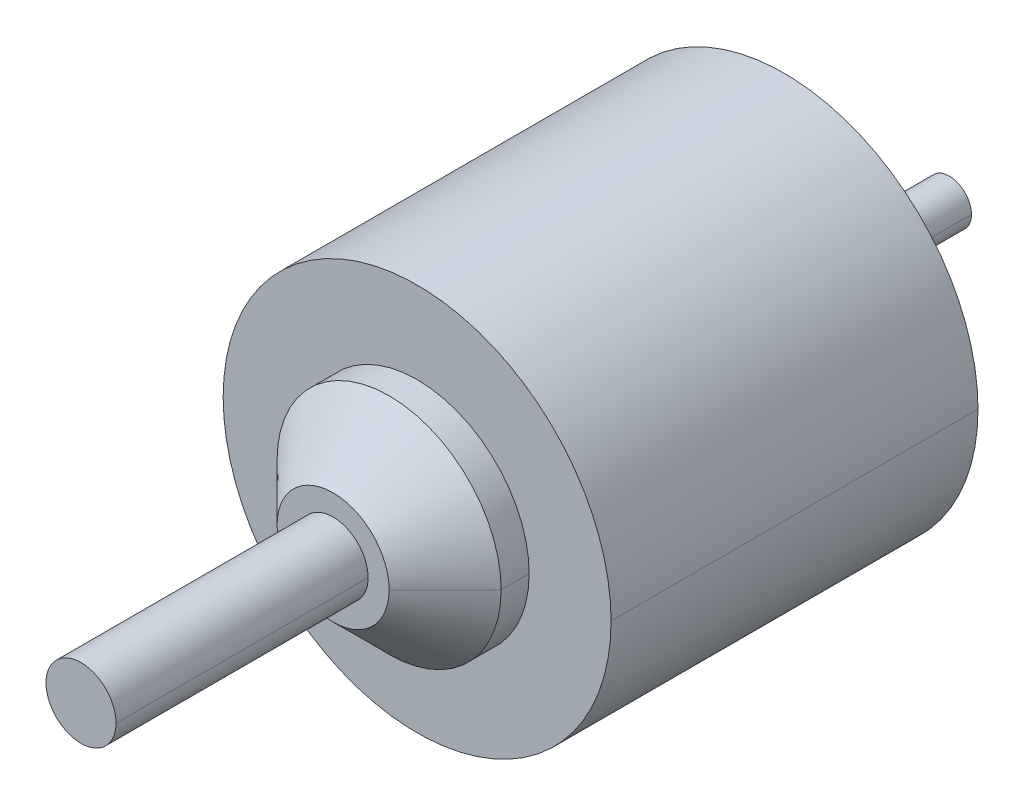
ISO-10303-21;
HEADER;
FILE_DESCRIPTION(('STEP AP214'),'2;1');
FILE_NAME('part.step','',(''),(''),'','','');
FILE_SCHEMA(('AUTOMOTIVE_DESIGN { 1 0 10303 214 1 1 1 1 }'));
ENDSEC;
DATA;
#1=APPLICATION_CONTEXT('core data for automotive mechanical design processes');
#2=APPLICATION_PROTOCOL_DEFINITION('international standard','automotive_design',2000,#1);
#3=PRODUCT_CONTEXT('',#1,'mechanical');
#4=PRODUCT('Part','Part','',(#3));
#5=PRODUCT_RELATED_PRODUCT_CATEGORY('part','',(#4));
#6=PRODUCT_DEFINITION_FORMATION('','',#4);
#7=PRODUCT_DEFINITION_CONTEXT('part definition',#1,'design');
#8=PRODUCT_DEFINITION('design','',#6,#7);
#9=PRODUCT_DEFINITION_SHAPE('','',#8);
#10=(LENGTH_UNIT() NAMED_UNIT(*) SI_UNIT(.MILLI.,.METRE.));
#11=(NAMED_UNIT(*) PLANE_ANGLE_UNIT() SI_UNIT($,.RADIAN.));
#12=(NAMED_UNIT(*) SI_UNIT($,.STERADIAN.) SOLID_ANGLE_UNIT());
#13=UNCERTAINTY_MEASURE_WITH_UNIT(LENGTH_MEASURE(1.E-05),#10,'distance_accuracy_value','');
#14=(GEOMETRIC_REPRESENTATION_CONTEXT(3) GLOBAL_UNCERTAINTY_ASSIGNED_CONTEXT((#13)) GLOBAL_UNIT_ASSIGNED_CONTEXT((#10,
#11,#12)) REPRESENTATION_CONTEXT('',''));
#15=CARTESIAN_POINT('',(0.,0.,0.));
#16=DIRECTION('',(0.,0.,1.));
#17=DIRECTION('',(1.,0.,0.));
#18=AXIS2_PLACEMENT_3D('',#15,#16,#17);
#19=CARTESIAN_POINT('',(0.,0.,50.2));
#20=DIRECTION('',(0.,0.,1.));
#21=DIRECTION('',(1.,0.,0.));
#22=AXIS2_PLACEMENT_3D('',#19,#20,#21);
#23=PLANE('',#22);
#24=CARTESIAN_POINT('',(0.,0.,50.2));
#25=DIRECTION('',(0.,0.,1.));
#26=DIRECTION('',(1.,0.,0.));
#27=AXIS2_PLACEMENT_3D('',#24,#25,#26);
#28=CIRCLE('',#27,2.5);
#29=CARTESIAN_POINT('',(2.5,0.,50.2));
#30=VERTEX_POINT('',#29);
#31=CARTESIAN_POINT('',(-2.5,0.,50.2));
#32=VERTEX_POINT('',#31);
#33=EDGE_CURVE('E11',#30,#32,#28,.T.);
#34=ORIENTED_EDGE('',*,*,#33,.T.);
#35=CARTESIAN_POINT('',(0.,0.,50.2));
#36=DIRECTION('',(0.,0.,1.));
#37=DIRECTION('',(1.,0.,0.));
#38=AXIS2_PLACEMENT_3D('',#35,#36,#37);
#39=CIRCLE('',#38,2.5);
#40=EDGE_CURVE('E335',#32,#30,#39,.T.);
#41=ORIENTED_EDGE('',*,*,#40,.T.);
#42=EDGE_LOOP('',(#34,#41));
#43=FACE_BOUND('',#42,.T.);
#44=ADVANCED_FACE('F18',(#43),#23,.T.);
#45=CARTESIAN_POINT('',(0.,0.,38.2));
#46=DIRECTION('',(0.,0.,1.));
#47=DIRECTION('',(1.,0.,0.));
#48=AXIS2_PLACEMENT_3D('',#45,#46,#47);
#49=CYLINDRICAL_SURFACE('',#48,2.5);
#50=DIRECTION('',(0.,0.,1.));
#51=VECTOR('',#50,1.);
#52=CARTESIAN_POINT('',(-2.5,0.,38.2));
#53=LINE('',#52,#51);
#54=CARTESIAN_POINT('',(-2.5,0.,32.2));
#55=VERTEX_POINT('',#54);
#56=EDGE_CURVE('E29',#55,#32,#53,.T.);
#57=ORIENTED_EDGE('',*,*,#56,.T.);
#58=ORIENTED_EDGE('',*,*,#33,.F.);
#59=DIRECTION('',(0.,0.,1.));
#60=VECTOR('',#59,1.);
#61=CARTESIAN_POINT('',(2.5,0.,38.2));
#62=LINE('',#61,#60);
#63=CARTESIAN_POINT('',(2.5,0.,32.2));
#64=VERTEX_POINT('',#63);
#65=EDGE_CURVE('E167',#64,#30,#62,.T.);
#66=ORIENTED_EDGE('',*,*,#65,.F.);
#67=CARTESIAN_POINT('',(0.,0.,32.2));
#68=DIRECTION('',(0.,0.,1.));
#69=DIRECTION('',(1.,0.,0.));
#70=AXIS2_PLACEMENT_3D('',#67,#68,#69);
#71=CIRCLE('',#70,2.5);
#72=EDGE_CURVE('E276',#64,#55,#71,.T.);
#73=ORIENTED_EDGE('',*,*,#72,.T.);
#74=EDGE_LOOP('',(#57,#58,#66,#73));
#75=FACE_BOUND('',#74,.T.);
#76=ADVANCED_FACE('F390',(#75),#49,.T.);
#77=CARTESIAN_POINT('',(0.,0.,38.2));
#78=DIRECTION('',(0.,0.,1.));
#79=DIRECTION('',(1.,0.,0.));
#80=AXIS2_PLACEMENT_3D('',#77,#78,#79);
#81=CYLINDRICAL_SURFACE('',#80,2.5);
#82=ORIENTED_EDGE('',*,*,#65,.T.);
#83=ORIENTED_EDGE('',*,*,#40,.F.);
#84=ORIENTED_EDGE('',*,*,#56,.F.);
#85=CARTESIAN_POINT('',(0.,0.,32.2));
#86=DIRECTION('',(0.,0.,1.));
#87=DIRECTION('',(1.,0.,0.));
#88=AXIS2_PLACEMENT_3D('',#85,#86,#87);
#89=CIRCLE('',#88,2.5);
#90=EDGE_CURVE('E278',#55,#64,#89,.T.);
#91=ORIENTED_EDGE('',*,*,#90,.T.);
#92=EDGE_LOOP('',(#82,#83,#84,#91));
#93=FACE_BOUND('',#92,.T.);
#94=ADVANCED_FACE('F387',(#93),#81,.T.);
#95=CARTESIAN_POINT('',(0.,0.,-5.9));
#96=DIRECTION('',(0.,0.,-1.));
#97=DIRECTION('',(1.,0.,0.));
#98=AXIS2_PLACEMENT_3D('',#95,#96,#97);
#99=CYLINDRICAL_SURFACE('',#98,1.585);
#100=DIRECTION('',(0.,0.,-1.));
#101=VECTOR('',#100,1.);
#102=CARTESIAN_POINT('',(1.585,0.,-5.9));
#103=LINE('',#102,#101);
#104=CARTESIAN_POINT('',(1.585,0.,0.));
#105=VERTEX_POINT('',#104);
#106=CARTESIAN_POINT('',(1.585,0.,-11.8));
#107=VERTEX_POINT('',#106);
#108=EDGE_CURVE('E245',#105,#107,#103,.T.);
#109=ORIENTED_EDGE('',*,*,#108,.F.);
#110=CARTESIAN_POINT('',(0.,0.,0.));
#111=DIRECTION('',(0.,0.,-1.));
#112=DIRECTION('',(1.,0.,0.));
#113=AXIS2_PLACEMENT_3D('',#110,#111,#112);
#114=CIRCLE('',#113,1.585);
#115=CARTESIAN_POINT('',(-1.585,0.,0.));
#116=VERTEX_POINT('',#115);
#117=EDGE_CURVE('E246',#105,#116,#114,.T.);
#118=ORIENTED_EDGE('',*,*,#117,.T.);
#119=DIRECTION('',(0.,0.,-1.));
#120=VECTOR('',#119,1.);
#121=CARTESIAN_POINT('',(-1.585,0.,-5.9));
#122=LINE('',#121,#120);
#123=CARTESIAN_POINT('',(-1.585,0.,-11.8));
#124=VERTEX_POINT('',#123);
#125=EDGE_CURVE('E242',#116,#124,#122,.T.);
#126=ORIENTED_EDGE('',*,*,#125,.T.);
#127=CARTESIAN_POINT('',(0.,0.,-11.8));
#128=DIRECTION('',(0.,0.,-1.));
#129=DIRECTION('',(1.,0.,0.));
#130=AXIS2_PLACEMENT_3D('',#127,#128,#129);
#131=CIRCLE('',#130,1.585);
#132=EDGE_CURVE('E306',#107,#124,#131,.T.);
#133=ORIENTED_EDGE('',*,*,#132,.F.);
#134=EDGE_LOOP('',(#109,#118,#126,#133));
#135=FACE_BOUND('',#134,.T.);
#136=ADVANCED_FACE('F389',(#135),#99,.T.);
#137=CARTESIAN_POINT('',(0.,0.,-5.9));
#138=DIRECTION('',(0.,0.,-1.));
#139=DIRECTION('',(1.,0.,0.));
#140=AXIS2_PLACEMENT_3D('',#137,#138,#139);
#141=CYLINDRICAL_SURFACE('',#140,1.585);
#142=ORIENTED_EDGE('',*,*,#125,.F.);
#143=CARTESIAN_POINT('',(0.,0.,0.));
#144=DIRECTION('',(0.,0.,-1.));
#145=DIRECTION('',(1.,0.,0.));
#146=AXIS2_PLACEMENT_3D('',#143,#144,#145);
#147=CIRCLE('',#146,1.585);
#148=EDGE_CURVE('E247',#116,#105,#147,.T.);
#149=ORIENTED_EDGE('',*,*,#148,.T.);
#150=ORIENTED_EDGE('',*,*,#108,.T.);
#151=CARTESIAN_POINT('',(0.,0.,-11.8));
#152=DIRECTION('',(0.,0.,-1.));
#153=DIRECTION('',(1.,0.,0.));
#154=AXIS2_PLACEMENT_3D('',#151,#152,#153);
#155=CIRCLE('',#154,1.585);
#156=EDGE_CURVE('E251',#124,#107,#155,.T.);
#157=ORIENTED_EDGE('',*,*,#156,.F.);
#158=EDGE_LOOP('',(#142,#149,#150,#157));
#159=FACE_BOUND('',#158,.T.);
#160=ADVANCED_FACE('F397',(#159),#141,.T.);
#161=CARTESIAN_POINT('',(0.,0.,0.));
#162=DIRECTION('',(0.,0.,1.));
#163=DIRECTION('',(1.,0.,0.));
#164=AXIS2_PLACEMENT_3D('',#161,#162,#163);
#165=PLANE('',#164);
#166=ORIENTED_EDGE('',*,*,#148,.F.);
#167=ORIENTED_EDGE('',*,*,#117,.F.);
#168=EDGE_LOOP('',(#166,#167));
#169=FACE_BOUND('',#168,.T.);
#170=CARTESIAN_POINT('',(9.5,0.,0.));
#171=DIRECTION('',(0.,0.,-1.));
#172=DIRECTION('',(1.,0.,0.));
#173=AXIS2_PLACEMENT_3D('',#170,#171,#172);
#174=CIRCLE('',#173,1.5);
#175=CARTESIAN_POINT('',(8.,0.,0.));
#176=VERTEX_POINT('',#175);
#177=CARTESIAN_POINT('',(11.,0.,0.));
#178=VERTEX_POINT('',#177);
#179=EDGE_CURVE('E261',#176,#178,#174,.T.);
#180=ORIENTED_EDGE('',*,*,#179,.F.);
#181=CARTESIAN_POINT('',(9.5,0.,0.));
#182=DIRECTION('',(0.,0.,-1.));
#183=DIRECTION('',(1.,0.,0.));
#184=AXIS2_PLACEMENT_3D('',#181,#182,#183);
#185=CIRCLE('',#184,1.5);
#186=EDGE_CURVE('E271',#178,#176,#185,.T.);
#187=ORIENTED_EDGE('',*,*,#186,.F.);
#188=EDGE_LOOP('',(#180,#187));
#189=FACE_BOUND('',#188,.T.);
#190=CARTESIAN_POINT('',(0.,-8.,0.));
#191=DIRECTION('',(0.,0.,-1.));
#192=DIRECTION('',(1.,0.,0.));
#193=AXIS2_PLACEMENT_3D('',#190,#191,#192);
#194=CIRCLE('',#193,1.5);
#195=CARTESIAN_POINT('',(-1.5,-8.,0.));
#196=VERTEX_POINT('',#195);
#197=CARTESIAN_POINT('',(1.5,-8.,0.));
#198=VERTEX_POINT('',#197);
#199=EDGE_CURVE('E254',#196,#198,#194,.T.);
#200=ORIENTED_EDGE('',*,*,#199,.F.);
#201=CARTESIAN_POINT('',(0.,-8.,0.));
#202=DIRECTION('',(0.,0.,-1.));
#203=DIRECTION('',(1.,0.,0.));
#204=AXIS2_PLACEMENT_3D('',#201,#202,#203);
#205=CIRCLE('',#204,1.5);
#206=EDGE_CURVE('E303',#198,#196,#205,.T.);
#207=ORIENTED_EDGE('',*,*,#206,.F.);
#208=EDGE_LOOP('',(#200,#207));
#209=FACE_BOUND('',#208,.T.);
#210=CARTESIAN_POINT('',(0.,8.,0.));
#211=DIRECTION('',(0.,0.,-1.));
#212=DIRECTION('',(1.,0.,0.));
#213=AXIS2_PLACEMENT_3D('',#210,#211,#212);
#214=CIRCLE('',#213,1.5);
#215=CARTESIAN_POINT('',(-1.5,8.,0.));
#216=VERTEX_POINT('',#215);
#217=CARTESIAN_POINT('',(1.5,8.,0.));
#218=VERTEX_POINT('',#217);
#219=EDGE_CURVE('E201',#216,#218,#214,.T.);
#220=ORIENTED_EDGE('',*,*,#219,.F.);
#221=CARTESIAN_POINT('',(0.,8.,0.));
#222=DIRECTION('',(0.,0.,-1.));
#223=DIRECTION('',(1.,0.,0.));
#224=AXIS2_PLACEMENT_3D('',#221,#222,#223);
#225=CIRCLE('',#224,1.5);
#226=EDGE_CURVE('E196',#218,#216,#225,.T.);
#227=ORIENTED_EDGE('',*,*,#226,.F.);
#228=EDGE_LOOP('',(#220,#227));
#229=FACE_BOUND('',#228,.T.);
#230=CARTESIAN_POINT('',(-9.5,0.,0.));
#231=DIRECTION('',(0.,0.,-1.));
#232=DIRECTION('',(1.,0.,0.));
#233=AXIS2_PLACEMENT_3D('',#230,#231,#232);
#234=CIRCLE('',#233,1.5);
#235=CARTESIAN_POINT('',(-8.,0.,0.));
#236=VERTEX_POINT('',#235);
#237=CARTESIAN_POINT('',(-11.,0.,0.));
#238=VERTEX_POINT('',#237);
#239=EDGE_CURVE('E234',#236,#238,#234,.T.);
#240=ORIENTED_EDGE('',*,*,#239,.F.);
#241=CARTESIAN_POINT('',(-9.5,0.,0.));
#242=DIRECTION('',(0.,0.,-1.));
#243=DIRECTION('',(1.,0.,0.));
#244=AXIS2_PLACEMENT_3D('',#241,#242,#243);
#245=CIRCLE('',#244,1.5);
#246=EDGE_CURVE('E202',#238,#236,#245,.T.);
#247=ORIENTED_EDGE('',*,*,#246,.F.);
#248=EDGE_LOOP('',(#240,#247));
#249=FACE_BOUND('',#248,.T.);
#250=CARTESIAN_POINT('',(0.,0.,0.));
#251=DIRECTION('',(0.,0.,1.));
#252=DIRECTION('',(1.,0.,0.));
#253=AXIS2_PLACEMENT_3D('',#250,#251,#252);
#254=CIRCLE('',#253,13.85);
#255=CARTESIAN_POINT('',(-13.85,0.,0.));
#256=VERTEX_POINT('',#255);
#257=CARTESIAN_POINT('',(13.85,0.,0.));
#258=VERTEX_POINT('',#257);
#259=EDGE_CURVE('E270',#256,#258,#254,.T.);
#260=ORIENTED_EDGE('',*,*,#259,.F.);
#261=CARTESIAN_POINT('',(0.,0.,0.));
#262=DIRECTION('',(0.,0.,1.));
#263=DIRECTION('',(1.,0.,0.));
#264=AXIS2_PLACEMENT_3D('',#261,#262,#263);
#265=CIRCLE('',#264,13.85);
#266=EDGE_CURVE('E310',#258,#256,#265,.T.);
#267=ORIENTED_EDGE('',*,*,#266,.F.);
#268=EDGE_LOOP('',(#260,#267));
#269=FACE_BOUND('',#268,.T.);
#270=ADVANCED_FACE('F425',(#169,#189,#209,#229,#249,#269),#165,.F.);
#271=CARTESIAN_POINT('',(0.,0.,-11.8));
#272=DIRECTION('',(0.,0.,-1.));
#273=DIRECTION('',(0.,-1.,0.));
#274=AXIS2_PLACEMENT_3D('',#271,#272,#273);
#275=PLANE('',#274);
#276=ORIENTED_EDGE('',*,*,#132,.T.);
#277=ORIENTED_EDGE('',*,*,#156,.T.);
#278=EDGE_LOOP('',(#276,#277));
#279=FACE_BOUND('',#278,.T.);
#280=ADVANCED_FACE('F422',(#279),#275,.T.);
#281=CARTESIAN_POINT('',(0.,0.,13.1));
#282=DIRECTION('',(0.,0.,1.));
#283=DIRECTION('',(1.,0.,0.));
#284=AXIS2_PLACEMENT_3D('',#281,#282,#283);
#285=CYLINDRICAL_SURFACE('',#284,13.85);
#286=DIRECTION('',(0.,0.,1.));
#287=VECTOR('',#286,1.);
#288=CARTESIAN_POINT('',(13.85,0.,13.1));
#289=LINE('',#288,#287);
#290=CARTESIAN_POINT('',(13.85,0.,26.2));
#291=VERTEX_POINT('',#290);
#292=EDGE_CURVE('E317',#258,#291,#289,.T.);
#293=ORIENTED_EDGE('',*,*,#292,.F.);
#294=ORIENTED_EDGE('',*,*,#266,.T.);
#295=DIRECTION('',(0.,0.,1.));
#296=VECTOR('',#295,1.);
#297=CARTESIAN_POINT('',(-13.85,0.,13.1));
#298=LINE('',#297,#296);
#299=CARTESIAN_POINT('',(-13.85,0.,26.2));
#300=VERTEX_POINT('',#299);
#301=EDGE_CURVE('E267',#256,#300,#298,.T.);
#302=ORIENTED_EDGE('',*,*,#301,.T.);
#303=CARTESIAN_POINT('',(0.,0.,26.2));
#304=DIRECTION('',(0.,0.,1.));
#305=DIRECTION('',(1.,0.,0.));
#306=AXIS2_PLACEMENT_3D('',#303,#304,#305);
#307=CIRCLE('',#306,13.85);
#308=EDGE_CURVE('E259',#291,#300,#307,.T.);
#309=ORIENTED_EDGE('',*,*,#308,.F.);
#310=EDGE_LOOP('',(#293,#294,#302,#309));
#311=FACE_BOUND('',#310,.T.);
#312=ADVANCED_FACE('F20',(#311),#285,.T.);
#313=CARTESIAN_POINT('',(0.,0.,13.1));
#314=DIRECTION('',(0.,0.,1.));
#315=DIRECTION('',(1.,0.,0.));
#316=AXIS2_PLACEMENT_3D('',#313,#314,#315);
#317=CYLINDRICAL_SURFACE('',#316,13.85);
#318=ORIENTED_EDGE('',*,*,#301,.F.);
#319=ORIENTED_EDGE('',*,*,#259,.T.);
#320=ORIENTED_EDGE('',*,*,#292,.T.);
#321=CARTESIAN_POINT('',(0.,0.,26.2));
#322=DIRECTION('',(0.,0.,1.));
#323=DIRECTION('',(1.,0.,0.));
#324=AXIS2_PLACEMENT_3D('',#321,#322,#323);
#325=CIRCLE('',#324,13.85);
#326=EDGE_CURVE('E235',#300,#291,#325,.T.);
#327=ORIENTED_EDGE('',*,*,#326,.F.);
#328=EDGE_LOOP('',(#318,#319,#320,#327));
#329=FACE_BOUND('',#328,.T.);
#330=ADVANCED_FACE('F350',(#329),#317,.T.);
#331=CARTESIAN_POINT('',(9.5,0.,2.));
#332=DIRECTION('',(0.,0.,-1.));
#333=DIRECTION('',(1.,0.,0.));
#334=AXIS2_PLACEMENT_3D('',#331,#332,#333);
#335=CYLINDRICAL_SURFACE('',#334,1.5);
#336=DIRECTION('',(0.,0.,1.));
#337=VECTOR('',#336,1.);
#338=CARTESIAN_POINT('',(11.,0.,2.));
#339=LINE('',#338,#337);
#340=CARTESIAN_POINT('',(11.,0.,4.));
#341=VERTEX_POINT('',#340);
#342=EDGE_CURVE('E265',#178,#341,#339,.T.);
#343=ORIENTED_EDGE('',*,*,#342,.F.);
#344=ORIENTED_EDGE('',*,*,#186,.T.);
#345=DIRECTION('',(0.,0.,1.));
#346=VECTOR('',#345,1.);
#347=CARTESIAN_POINT('',(8.,0.,2.));
#348=LINE('',#347,#346);
#349=CARTESIAN_POINT('',(8.,0.,4.));
#350=VERTEX_POINT('',#349);
#351=EDGE_CURVE('E266',#176,#350,#348,.T.);
#352=ORIENTED_EDGE('',*,*,#351,.T.);
#353=CARTESIAN_POINT('',(9.5,0.,4.));
#354=DIRECTION('',(0.,0.,-1.));
#355=DIRECTION('',(1.,0.,0.));
#356=AXIS2_PLACEMENT_3D('',#353,#354,#355);
#357=CIRCLE('',#356,1.5);
#358=EDGE_CURVE('E260',#341,#350,#357,.T.);
#359=ORIENTED_EDGE('',*,*,#358,.F.);
#360=EDGE_LOOP('',(#343,#344,#352,#359));
#361=FACE_BOUND('',#360,.T.);
#362=ADVANCED_FACE('F418',(#361),#335,.F.);
#363=CARTESIAN_POINT('',(9.5,0.,2.));
#364=DIRECTION('',(0.,0.,-1.));
#365=DIRECTION('',(1.,0.,0.));
#366=AXIS2_PLACEMENT_3D('',#363,#364,#365);
#367=CYLINDRICAL_SURFACE('',#366,1.5);
#368=ORIENTED_EDGE('',*,*,#351,.F.);
#369=ORIENTED_EDGE('',*,*,#179,.T.);
#370=ORIENTED_EDGE('',*,*,#342,.T.);
#371=CARTESIAN_POINT('',(9.5,0.,4.));
#372=DIRECTION('',(0.,0.,-1.));
#373=DIRECTION('',(1.,0.,0.));
#374=AXIS2_PLACEMENT_3D('',#371,#372,#373);
#375=CIRCLE('',#374,1.5);
#376=EDGE_CURVE('E255',#350,#341,#375,.T.);
#377=ORIENTED_EDGE('',*,*,#376,.F.);
#378=EDGE_LOOP('',(#368,#369,#370,#377));
#379=FACE_BOUND('',#378,.T.);
#380=ADVANCED_FACE('F416',(#379),#367,.F.);
#381=CARTESIAN_POINT('',(0.,-8.,2.));
#382=DIRECTION('',(0.,0.,-1.));
#383=DIRECTION('',(1.,0.,0.));
#384=AXIS2_PLACEMENT_3D('',#381,#382,#383);
#385=CYLINDRICAL_SURFACE('',#384,1.5);
#386=DIRECTION('',(0.,0.,1.));
#387=VECTOR('',#386,1.);
#388=CARTESIAN_POINT('',(1.5,-8.,2.));
#389=LINE('',#388,#387);
#390=CARTESIAN_POINT('',(1.5,-8.,4.));
#391=VERTEX_POINT('',#390);
#392=EDGE_CURVE('E301',#198,#391,#389,.T.);
#393=ORIENTED_EDGE('',*,*,#392,.F.);
#394=ORIENTED_EDGE('',*,*,#206,.T.);
#395=DIRECTION('',(0.,0.,1.));
#396=VECTOR('',#395,1.);
#397=CARTESIAN_POINT('',(-1.5,-8.,2.));
#398=LINE('',#397,#396);
#399=CARTESIAN_POINT('',(-1.5,-8.,4.));
#400=VERTEX_POINT('',#399);
#401=EDGE_CURVE('E240',#196,#400,#398,.T.);
#402=ORIENTED_EDGE('',*,*,#401,.T.);
#403=CARTESIAN_POINT('',(0.,-8.,4.));
#404=DIRECTION('',(0.,0.,-1.));
#405=DIRECTION('',(1.,0.,0.));
#406=AXIS2_PLACEMENT_3D('',#403,#404,#405);
#407=CIRCLE('',#406,1.5);
#408=EDGE_CURVE('E210',#391,#400,#407,.T.);
#409=ORIENTED_EDGE('',*,*,#408,.F.);
#410=EDGE_LOOP('',(#393,#394,#402,#409));
#411=FACE_BOUND('',#410,.T.);
#412=ADVANCED_FACE('F412',(#411),#385,.F.);
#413=CARTESIAN_POINT('',(0.,-8.,2.));
#414=DIRECTION('',(0.,0.,-1.));
#415=DIRECTION('',(1.,0.,0.));
#416=AXIS2_PLACEMENT_3D('',#413,#414,#415);
#417=CYLINDRICAL_SURFACE('',#416,1.5);
#418=ORIENTED_EDGE('',*,*,#401,.F.);
#419=ORIENTED_EDGE('',*,*,#199,.T.);
#420=ORIENTED_EDGE('',*,*,#392,.T.);
#421=CARTESIAN_POINT('',(0.,-8.,4.));
#422=DIRECTION('',(0.,0.,-1.));
#423=DIRECTION('',(1.,0.,0.));
#424=AXIS2_PLACEMENT_3D('',#421,#422,#423);
#425=CIRCLE('',#424,1.5);
#426=EDGE_CURVE('E314',#400,#391,#425,.T.);
#427=ORIENTED_EDGE('',*,*,#426,.F.);
#428=EDGE_LOOP('',(#418,#419,#420,#427));
#429=FACE_BOUND('',#428,.T.);
#430=ADVANCED_FACE('F415',(#429),#417,.F.);
#431=CARTESIAN_POINT('',(0.,8.,2.));
#432=DIRECTION('',(0.,0.,-1.));
#433=DIRECTION('',(1.,0.,0.));
#434=AXIS2_PLACEMENT_3D('',#431,#432,#433);
#435=CYLINDRICAL_SURFACE('',#434,1.5);
#436=DIRECTION('',(0.,0.,1.));
#437=VECTOR('',#436,1.);
#438=CARTESIAN_POINT('',(1.5,8.,2.));
#439=LINE('',#438,#437);
#440=CARTESIAN_POINT('',(1.5,8.,4.));
#441=VERTEX_POINT('',#440);
#442=EDGE_CURVE('E207',#218,#441,#439,.T.);
#443=ORIENTED_EDGE('',*,*,#442,.F.);
#444=ORIENTED_EDGE('',*,*,#226,.T.);
#445=DIRECTION('',(0.,0.,1.));
#446=VECTOR('',#445,1.);
#447=CARTESIAN_POINT('',(-1.5,8.,2.));
#448=LINE('',#447,#446);
#449=CARTESIAN_POINT('',(-1.5,8.,4.));
#450=VERTEX_POINT('',#449);
#451=EDGE_CURVE('E190',#216,#450,#448,.T.);
#452=ORIENTED_EDGE('',*,*,#451,.T.);
#453=CARTESIAN_POINT('',(0.,8.,4.));
#454=DIRECTION('',(0.,0.,-1.));
#455=DIRECTION('',(1.,0.,0.));
#456=AXIS2_PLACEMENT_3D('',#453,#454,#455);
#457=CIRCLE('',#456,1.5);
#458=EDGE_CURVE('E195',#441,#450,#457,.T.);
#459=ORIENTED_EDGE('',*,*,#458,.F.);
#460=EDGE_LOOP('',(#443,#444,#452,#459));
#461=FACE_BOUND('',#460,.T.);
#462=ADVANCED_FACE('F193',(#461),#435,.F.);
#463=CARTESIAN_POINT('',(0.,8.,2.));
#464=DIRECTION('',(0.,0.,-1.));
#465=DIRECTION('',(1.,0.,0.));
#466=AXIS2_PLACEMENT_3D('',#463,#464,#465);
#467=CYLINDRICAL_SURFACE('',#466,1.5);
#468=ORIENTED_EDGE('',*,*,#451,.F.);
#469=ORIENTED_EDGE('',*,*,#219,.T.);
#470=ORIENTED_EDGE('',*,*,#442,.T.);
#471=CARTESIAN_POINT('',(0.,8.,4.));
#472=DIRECTION('',(0.,0.,-1.));
#473=DIRECTION('',(1.,0.,0.));
#474=AXIS2_PLACEMENT_3D('',#471,#472,#473);
#475=CIRCLE('',#474,1.5);
#476=EDGE_CURVE('E205',#450,#441,#475,.T.);
#477=ORIENTED_EDGE('',*,*,#476,.F.);
#478=EDGE_LOOP('',(#468,#469,#470,#477));
#479=FACE_BOUND('',#478,.T.);
#480=ADVANCED_FACE('F206',(#479),#467,.F.);
#481=CARTESIAN_POINT('',(-9.5,0.,2.));
#482=DIRECTION('',(0.,0.,-1.));
#483=DIRECTION('',(-1.,0.,0.));
#484=AXIS2_PLACEMENT_3D('',#481,#482,#483);
#485=CYLINDRICAL_SURFACE('',#484,1.5);
#486=DIRECTION('',(0.,0.,1.));
#487=VECTOR('',#486,1.);
#488=CARTESIAN_POINT('',(-11.,0.,2.));
#489=LINE('',#488,#487);
#490=CARTESIAN_POINT('',(-11.,0.,4.));
#491=VERTEX_POINT('',#490);
#492=EDGE_CURVE('E236',#238,#491,#489,.T.);
#493=ORIENTED_EDGE('',*,*,#492,.F.);
#494=ORIENTED_EDGE('',*,*,#246,.T.);
#495=DIRECTION('',(0.,0.,1.));
#496=VECTOR('',#495,1.);
#497=CARTESIAN_POINT('',(-8.,0.,2.));
#498=LINE('',#497,#496);
#499=CARTESIAN_POINT('',(-8.,0.,4.));
#500=VERTEX_POINT('',#499);
#501=EDGE_CURVE('E231',#236,#500,#498,.T.);
#502=ORIENTED_EDGE('',*,*,#501,.T.);
#503=CARTESIAN_POINT('',(-9.5,0.,4.));
#504=DIRECTION('',(0.,0.,-1.));
#505=DIRECTION('',(1.,0.,0.));
#506=AXIS2_PLACEMENT_3D('',#503,#504,#505);
#507=CIRCLE('',#506,1.5);
#508=EDGE_CURVE('E220',#491,#500,#507,.T.);
#509=ORIENTED_EDGE('',*,*,#508,.F.);
#510=EDGE_LOOP('',(#493,#494,#502,#509));
#511=FACE_BOUND('',#510,.T.);
#512=ADVANCED_FACE('F411',(#511),#485,.F.);
#513=CARTESIAN_POINT('',(-9.5,0.,2.));
#514=DIRECTION('',(0.,0.,-1.));
#515=DIRECTION('',(-1.,0.,0.));
#516=AXIS2_PLACEMENT_3D('',#513,#514,#515);
#517=CYLINDRICAL_SURFACE('',#516,1.5);
#518=ORIENTED_EDGE('',*,*,#501,.F.);
#519=ORIENTED_EDGE('',*,*,#239,.T.);
#520=ORIENTED_EDGE('',*,*,#492,.T.);
#521=CARTESIAN_POINT('',(-9.5,0.,4.));
#522=DIRECTION('',(0.,0.,-1.));
#523=DIRECTION('',(1.,0.,0.));
#524=AXIS2_PLACEMENT_3D('',#521,#522,#523);
#525=CIRCLE('',#524,1.5);
#526=EDGE_CURVE('E22',#500,#491,#525,.T.);
#527=ORIENTED_EDGE('',*,*,#526,.F.);
#528=EDGE_LOOP('',(#518,#519,#520,#527));
#529=FACE_BOUND('',#528,.T.);
#530=ADVANCED_FACE('F429',(#529),#517,.F.);
#531=CARTESIAN_POINT('',(0.,0.,26.2));
#532=DIRECTION('',(0.,0.,1.));
#533=DIRECTION('',(1.,0.,0.));
#534=AXIS2_PLACEMENT_3D('',#531,#532,#533);
#535=PLANE('',#534);
#536=CARTESIAN_POINT('',(0.,0.,26.2));
#537=DIRECTION('',(0.,0.,1.));
#538=DIRECTION('',(1.,0.,0.));
#539=AXIS2_PLACEMENT_3D('',#536,#537,#538);
#540=CIRCLE('',#539,8.);
#541=CARTESIAN_POINT('',(8.,0.,26.2));
#542=VERTEX_POINT('',#541);
#543=CARTESIAN_POINT('',(-8.,0.,26.2));
#544=VERTEX_POINT('',#543);
#545=EDGE_CURVE('E149',#542,#544,#540,.T.);
#546=ORIENTED_EDGE('',*,*,#545,.F.);
#547=CARTESIAN_POINT('',(0.,0.,26.2));
#548=DIRECTION('',(0.,0.,1.));
#549=DIRECTION('',(1.,0.,0.));
#550=AXIS2_PLACEMENT_3D('',#547,#548,#549);
#551=CIRCLE('',#550,8.);
#552=EDGE_CURVE('E225',#544,#542,#551,.T.);
#553=ORIENTED_EDGE('',*,*,#552,.F.);
#554=EDGE_LOOP('',(#546,#553));
#555=FACE_BOUND('',#554,.T.);
#556=ORIENTED_EDGE('',*,*,#308,.T.);
#557=ORIENTED_EDGE('',*,*,#326,.T.);
#558=EDGE_LOOP('',(#556,#557));
#559=FACE_BOUND('',#558,.T.);
#560=ADVANCED_FACE('F342',(#555,#559),#535,.T.);
#561=CARTESIAN_POINT('',(0.,0.,4.));
#562=DIRECTION('',(0.,0.,-1.));
#563=DIRECTION('',(0.,-1.,0.));
#564=AXIS2_PLACEMENT_3D('',#561,#562,#563);
#565=PLANE('',#564);
#566=ORIENTED_EDGE('',*,*,#358,.T.);
#567=ORIENTED_EDGE('',*,*,#376,.T.);
#568=EDGE_LOOP('',(#566,#567));
#569=FACE_BOUND('',#568,.T.);
#570=ADVANCED_FACE('F443',(#569),#565,.T.);
#571=CARTESIAN_POINT('',(0.,0.,4.));
#572=DIRECTION('',(0.,0.,-1.));
#573=DIRECTION('',(0.,-1.,0.));
#574=AXIS2_PLACEMENT_3D('',#571,#572,#573);
#575=PLANE('',#574);
#576=ORIENTED_EDGE('',*,*,#408,.T.);
#577=ORIENTED_EDGE('',*,*,#426,.T.);
#578=EDGE_LOOP('',(#576,#577));
#579=FACE_BOUND('',#578,.T.);
#580=ADVANCED_FACE('F441',(#579),#575,.T.);
#581=CARTESIAN_POINT('',(0.,0.,4.));
#582=DIRECTION('',(0.,0.,-1.));
#583=DIRECTION('',(0.,-1.,0.));
#584=AXIS2_PLACEMENT_3D('',#581,#582,#583);
#585=PLANE('',#584);
#586=ORIENTED_EDGE('',*,*,#458,.T.);
#587=ORIENTED_EDGE('',*,*,#476,.T.);
#588=EDGE_LOOP('',(#586,#587));
#589=FACE_BOUND('',#588,.T.);
#590=ADVANCED_FACE('F212',(#589),#585,.T.);
#591=CARTESIAN_POINT('',(0.,0.,4.));
#592=DIRECTION('',(0.,0.,-1.));
#593=DIRECTION('',(0.,-1.,0.));
#594=AXIS2_PLACEMENT_3D('',#591,#592,#593);
#595=PLANE('',#594);
#596=ORIENTED_EDGE('',*,*,#508,.T.);
#597=ORIENTED_EDGE('',*,*,#526,.T.);
#598=EDGE_LOOP('',(#596,#597));
#599=FACE_BOUND('',#598,.T.);
#600=ADVANCED_FACE('F431',(#599),#595,.T.);
#601=CARTESIAN_POINT('',(0.,0.,29.2));
#602=DIRECTION('',(0.,0.,1.));
#603=DIRECTION('',(1.,0.,0.));
#604=AXIS2_PLACEMENT_3D('',#601,#602,#603);
#605=CYLINDRICAL_SURFACE('',#604,8.);
#606=DIRECTION('',(0.,0.,1.));
#607=VECTOR('',#606,1.);
#608=CARTESIAN_POINT('',(8.,0.,29.2));
#609=LINE('',#608,#607);
#610=CARTESIAN_POINT('',(8.,0.,28.2));
#611=VERTEX_POINT('',#610);
#612=EDGE_CURVE('E229',#542,#611,#609,.T.);
#613=ORIENTED_EDGE('',*,*,#612,.F.);
#614=ORIENTED_EDGE('',*,*,#545,.T.);
#615=DIRECTION('',(0.,0.,1.));
#616=VECTOR('',#615,1.);
#617=CARTESIAN_POINT('',(-8.,0.,29.2));
#618=LINE('',#617,#616);
#619=CARTESIAN_POINT('',(-8.,0.,28.2));
#620=VERTEX_POINT('',#619);
#621=EDGE_CURVE('E230',#544,#620,#618,.T.);
#622=ORIENTED_EDGE('',*,*,#621,.T.);
#623=CARTESIAN_POINT('',(0.,0.,28.2));
#624=DIRECTION('',(0.,0.,1.));
#625=DIRECTION('',(1.,0.,0.));
#626=AXIS2_PLACEMENT_3D('',#623,#624,#625);
#627=CIRCLE('',#626,8.);
#628=EDGE_CURVE('E223',#611,#620,#627,.T.);
#629=ORIENTED_EDGE('',*,*,#628,.F.);
#630=EDGE_LOOP('',(#613,#614,#622,#629));
#631=FACE_BOUND('',#630,.T.);
#632=ADVANCED_FACE('F434',(#631),#605,.T.);
#633=CARTESIAN_POINT('',(0.,0.,29.2));
#634=DIRECTION('',(0.,0.,1.));
#635=DIRECTION('',(1.,0.,0.));
#636=AXIS2_PLACEMENT_3D('',#633,#634,#635);
#637=CYLINDRICAL_SURFACE('',#636,8.);
#638=ORIENTED_EDGE('',*,*,#621,.F.);
#639=ORIENTED_EDGE('',*,*,#552,.T.);
#640=ORIENTED_EDGE('',*,*,#612,.T.);
#641=CARTESIAN_POINT('',(0.,0.,28.2));
#642=DIRECTION('',(0.,0.,1.));
#643=DIRECTION('',(1.,0.,0.));
#644=AXIS2_PLACEMENT_3D('',#641,#642,#643);
#645=CIRCLE('',#644,8.);
#646=EDGE_CURVE('E292',#620,#611,#645,.T.);
#647=ORIENTED_EDGE('',*,*,#646,.F.);
#648=EDGE_LOOP('',(#638,#639,#640,#647));
#649=FACE_BOUND('',#648,.T.);
#650=ADVANCED_FACE('F454',(#649),#637,.T.);
#651=CARTESIAN_POINT('',(0.,0.,32.2));
#652=DIRECTION('',(0.,0.,1.));
#653=DIRECTION('',(1.,0.,0.));
#654=AXIS2_PLACEMENT_3D('',#651,#652,#653);
#655=PLANE('',#654);
#656=ORIENTED_EDGE('',*,*,#90,.F.);
#657=ORIENTED_EDGE('',*,*,#72,.F.);
#658=EDGE_LOOP('',(#656,#657));
#659=FACE_BOUND('',#658,.T.);
#660=CARTESIAN_POINT('',(0.,0.,32.2));
#661=DIRECTION('',(0.,0.,1.));
#662=DIRECTION('',(1.,0.,0.));
#663=AXIS2_PLACEMENT_3D('',#660,#661,#662);
#664=CIRCLE('',#663,4.);
#665=CARTESIAN_POINT('',(-4.,0.,32.2));
#666=VERTEX_POINT('',#665);
#667=CARTESIAN_POINT('',(4.,0.,32.2));
#668=VERTEX_POINT('',#667);
#669=EDGE_CURVE('E287',#666,#668,#664,.T.);
#670=ORIENTED_EDGE('',*,*,#669,.T.);
#671=CARTESIAN_POINT('',(0.,0.,32.2));
#672=DIRECTION('',(0.,0.,1.));
#673=DIRECTION('',(1.,0.,0.));
#674=AXIS2_PLACEMENT_3D('',#671,#672,#673);
#675=CIRCLE('',#674,4.);
#676=EDGE_CURVE('E329',#668,#666,#675,.T.);
#677=ORIENTED_EDGE('',*,*,#676,.T.);
#678=EDGE_LOOP('',(#670,#677));
#679=FACE_BOUND('',#678,.T.);
#680=ADVANCED_FACE('F451',(#659,#679),#655,.T.);
#681=CARTESIAN_POINT('',(0.,0.,35.2));
#682=DIRECTION('',(0.,0.,-1.));
#683=DIRECTION('',(-0.50000000000019,0.866025403784329,0.));
#684=AXIS2_PLACEMENT_3D('',#681,#682,#683);
#685=CONICAL_SURFACE('',#684,0.999999999999103,0.785398163397001);
#686=DIRECTION('',(-0.707106781186548,0.,-0.707106781186548));
#687=VECTOR('',#686,1.);
#688=CARTESIAN_POINT('',(-6.,0.,30.2));
#689=LINE('',#688,#687);
#690=EDGE_CURVE('E333',#666,#620,#689,.T.);
#691=ORIENTED_EDGE('',*,*,#690,.T.);
#692=ORIENTED_EDGE('',*,*,#646,.T.);
#693=DIRECTION('',(0.707106781186548,0.,-0.707106781186548));
#694=VECTOR('',#693,1.);
#695=CARTESIAN_POINT('',(6.,0.,30.2));
#696=LINE('',#695,#694);
#697=EDGE_CURVE('E367',#668,#611,#696,.T.);
#698=ORIENTED_EDGE('',*,*,#697,.F.);
#699=ORIENTED_EDGE('',*,*,#669,.F.);
#700=EDGE_LOOP('',(#691,#692,#698,#699));
#701=FACE_BOUND('',#700,.T.);
#702=ADVANCED_FACE('F407',(#701),#685,.T.);
#703=CARTESIAN_POINT('',(0.,0.,35.2));
#704=DIRECTION('',(0.,0.,-1.));
#705=DIRECTION('',(1.,0.,0.));
#706=AXIS2_PLACEMENT_3D('',#703,#704,#705);
#707=CONICAL_SURFACE('',#706,0.999999999999103,0.785398163397001);
#708=ORIENTED_EDGE('',*,*,#697,.T.);
#709=ORIENTED_EDGE('',*,*,#628,.T.);
#710=ORIENTED_EDGE('',*,*,#690,.F.);
#711=ORIENTED_EDGE('',*,*,#676,.F.);
#712=EDGE_LOOP('',(#708,#709,#710,#711));
#713=FACE_BOUND('',#712,.T.);
#714=ADVANCED_FACE('F462',(#713),#707,.T.);
#715=CLOSED_SHELL('',(#44,#76,#94,#136,#160,#270,#280,#312,#330,#362,#380,#412,#430,#462,#480,
#512,#530,#560,#570,#580,#590,#600,#632,#650,#680,#702,#714));
#716=MANIFOLD_SOLID_BREP('B1',#715);
#717=ADVANCED_BREP_SHAPE_REPRESENTATION('',(#18,#716),#14);
#718=SHAPE_DEFINITION_REPRESENTATION(#9,#717);
ENDSEC;
END-ISO-10303-21;
